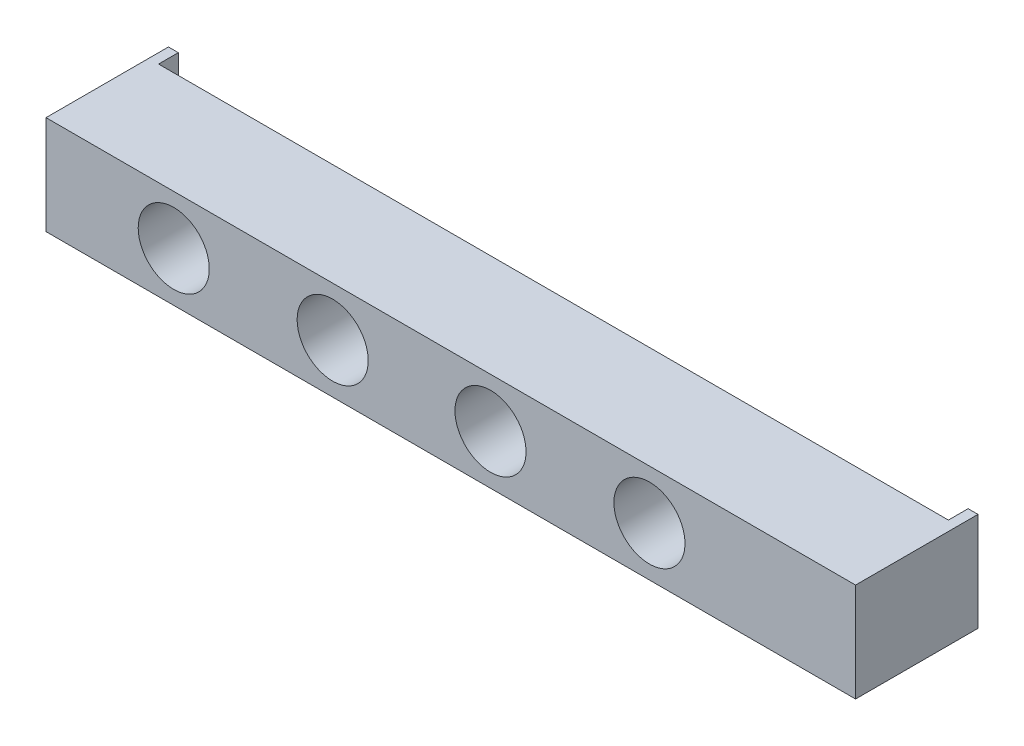
ISO-10303-21;
HEADER;
FILE_DESCRIPTION(('STEP AP214'),'2;1');
FILE_NAME('part.step','',(''),(''),'','','');
FILE_SCHEMA(('AUTOMOTIVE_DESIGN { 1 0 10303 214 1 1 1 1 }'));
ENDSEC;
DATA;
#1=APPLICATION_CONTEXT('core data for automotive mechanical design processes');
#2=APPLICATION_PROTOCOL_DEFINITION('international standard','automotive_design',2000,#1);
#3=PRODUCT_CONTEXT('',#1,'mechanical');
#4=PRODUCT('Part','Part','',(#3));
#5=PRODUCT_RELATED_PRODUCT_CATEGORY('part','',(#4));
#6=PRODUCT_DEFINITION_FORMATION('','',#4);
#7=PRODUCT_DEFINITION_CONTEXT('part definition',#1,'design');
#8=PRODUCT_DEFINITION('design','',#6,#7);
#9=PRODUCT_DEFINITION_SHAPE('','',#8);
#10=(LENGTH_UNIT() NAMED_UNIT(*) SI_UNIT(.MILLI.,.METRE.));
#11=(NAMED_UNIT(*) PLANE_ANGLE_UNIT() SI_UNIT($,.RADIAN.));
#12=(NAMED_UNIT(*) SI_UNIT($,.STERADIAN.) SOLID_ANGLE_UNIT());
#13=UNCERTAINTY_MEASURE_WITH_UNIT(LENGTH_MEASURE(1.E-05),#10,'distance_accuracy_value','');
#14=(GEOMETRIC_REPRESENTATION_CONTEXT(3) GLOBAL_UNCERTAINTY_ASSIGNED_CONTEXT((#13)) GLOBAL_UNIT_ASSIGNED_CONTEXT((#10,
#11,#12)) REPRESENTATION_CONTEXT('',''));
#15=CARTESIAN_POINT('',(0.,0.,0.));
#16=DIRECTION('',(0.,0.,1.));
#17=DIRECTION('',(1.,0.,0.));
#18=AXIS2_PLACEMENT_3D('',#15,#16,#17);
#19=CARTESIAN_POINT('',(0.,0.,0.));
#20=DIRECTION('',(0.,0.,-1.));
#21=DIRECTION('',(-1.,0.,0.));
#22=AXIS2_PLACEMENT_3D('',#19,#20,#21);
#23=PLANE('',#22);
#24=CARTESIAN_POINT('',(32.3443244123659,12.5,0.));
#25=DIRECTION('',(0.,0.,-1.));
#26=DIRECTION('',(-1.,0.,0.));
#27=AXIS2_PLACEMENT_3D('',#24,#25,#26);
#28=CIRCLE('',#27,8.99999999999999);
#29=CARTESIAN_POINT('',(23.3443244123659,12.5,0.));
#30=VERTEX_POINT('',#29);
#31=EDGE_CURVE('E330',#30,#30,#28,.T.);
#32=ORIENTED_EDGE('',*,*,#31,.F.);
#33=EDGE_LOOP('',(#32));
#34=FACE_BOUND('',#33,.T.);
#35=CARTESIAN_POINT('',(72.5886654471327,12.5,0.));
#36=DIRECTION('',(0.,0.,-1.));
#37=DIRECTION('',(-1.,0.,0.));
#38=AXIS2_PLACEMENT_3D('',#35,#36,#37);
#39=CIRCLE('',#38,8.99999999999999);
#40=CARTESIAN_POINT('',(63.5886654471327,12.5,0.));
#41=VERTEX_POINT('',#40);
#42=EDGE_CURVE('E332',#41,#41,#39,.T.);
#43=ORIENTED_EDGE('',*,*,#42,.F.);
#44=EDGE_LOOP('',(#43));
#45=FACE_BOUND('',#44,.T.);
#46=CARTESIAN_POINT('',(112.561085258692,12.5,0.));
#47=DIRECTION('',(0.,0.,-1.));
#48=DIRECTION('',(-1.,0.,0.));
#49=AXIS2_PLACEMENT_3D('',#46,#47,#48);
#50=CIRCLE('',#49,8.99999999999999);
#51=CARTESIAN_POINT('',(103.561085258692,12.5,0.));
#52=VERTEX_POINT('',#51);
#53=EDGE_CURVE('E340',#52,#52,#50,.T.);
#54=ORIENTED_EDGE('',*,*,#53,.F.);
#55=EDGE_LOOP('',(#54));
#56=FACE_BOUND('',#55,.T.);
#57=CARTESIAN_POINT('',(152.805426293458,12.5,0.));
#58=DIRECTION('',(0.,0.,-1.));
#59=DIRECTION('',(-1.,0.,0.));
#60=AXIS2_PLACEMENT_3D('',#57,#58,#59);
#61=CIRCLE('',#60,8.99999999999998);
#62=CARTESIAN_POINT('',(143.805426293458,12.5,0.));
#63=VERTEX_POINT('',#62);
#64=EDGE_CURVE('E345',#63,#63,#61,.T.);
#65=ORIENTED_EDGE('',*,*,#64,.F.);
#66=EDGE_LOOP('',(#65));
#67=FACE_BOUND('',#66,.T.);
#68=DIRECTION('',(-1.,0.,0.));
#69=VECTOR('',#68,1.);
#70=CARTESIAN_POINT('',(0.,25.,0.));
#71=LINE('',#70,#69);
#72=CARTESIAN_POINT('',(202.5,25.,0.));
#73=VERTEX_POINT('',#72);
#74=CARTESIAN_POINT('',(2.5,25.,0.));
#75=VERTEX_POINT('',#74);
#76=EDGE_CURVE('E55',#73,#75,#71,.T.);
#77=ORIENTED_EDGE('',*,*,#76,.F.);
#78=DIRECTION('',(0.,1.,0.));
#79=VECTOR('',#78,1.);
#80=CARTESIAN_POINT('',(202.5,25.,0.));
#81=LINE('',#80,#79);
#82=CARTESIAN_POINT('',(202.5,0.,0.));
#83=VERTEX_POINT('',#82);
#84=EDGE_CURVE('E121',#83,#73,#81,.T.);
#85=ORIENTED_EDGE('',*,*,#84,.F.);
#86=DIRECTION('',(1.,0.,0.));
#87=VECTOR('',#86,1.);
#88=CARTESIAN_POINT('',(0.,0.,0.));
#89=LINE('',#88,#87);
#90=CARTESIAN_POINT('',(2.5,0.,0.));
#91=VERTEX_POINT('',#90);
#92=EDGE_CURVE('E151',#91,#83,#89,.T.);
#93=ORIENTED_EDGE('',*,*,#92,.F.);
#94=DIRECTION('',(0.,-1.,0.));
#95=VECTOR('',#94,1.);
#96=CARTESIAN_POINT('',(2.5,25.,0.));
#97=LINE('',#96,#95);
#98=EDGE_CURVE('E132',#75,#91,#97,.T.);
#99=ORIENTED_EDGE('',*,*,#98,.F.);
#100=EDGE_LOOP('',(#77,#85,#93,#99));
#101=FACE_BOUND('',#100,.T.);
#102=ADVANCED_FACE('F35',(#34,#45,#56,#67,#101),#23,.T.);
#103=CARTESIAN_POINT('',(0.,0.,26.));
#104=DIRECTION('',(1.,0.,0.));
#105=DIRECTION('',(0.,0.,-1.));
#106=AXIS2_PLACEMENT_3D('',#103,#104,#105);
#107=PLANE('',#106);
#108=DIRECTION('',(0.,0.,-1.));
#109=VECTOR('',#108,1.);
#110=CARTESIAN_POINT('',(0.,25.,26.));
#111=LINE('',#110,#109);
#112=CARTESIAN_POINT('',(0.,25.,26.));
#113=VERTEX_POINT('',#112);
#114=CARTESIAN_POINT('',(0.,25.,-5.));
#115=VERTEX_POINT('',#114);
#116=EDGE_CURVE('E160',#113,#115,#111,.T.);
#117=ORIENTED_EDGE('',*,*,#116,.T.);
#118=DIRECTION('',(0.,1.,0.));
#119=VECTOR('',#118,1.);
#120=CARTESIAN_POINT('',(0.,25.,-5.));
#121=LINE('',#120,#119);
#122=CARTESIAN_POINT('',(0.,0.,-5.));
#123=VERTEX_POINT('',#122);
#124=EDGE_CURVE('E133',#123,#115,#121,.T.);
#125=ORIENTED_EDGE('',*,*,#124,.F.);
#126=DIRECTION('',(0.,0.,-1.));
#127=VECTOR('',#126,1.);
#128=CARTESIAN_POINT('',(0.,0.,26.));
#129=LINE('',#128,#127);
#130=CARTESIAN_POINT('',(0.,0.,26.));
#131=VERTEX_POINT('',#130);
#132=EDGE_CURVE('E11',#131,#123,#129,.T.);
#133=ORIENTED_EDGE('',*,*,#132,.F.);
#134=DIRECTION('',(0.,-1.,0.));
#135=VECTOR('',#134,1.);
#136=CARTESIAN_POINT('',(0.,0.,26.));
#137=LINE('',#136,#135);
#138=EDGE_CURVE('E152',#113,#131,#137,.T.);
#139=ORIENTED_EDGE('',*,*,#138,.F.);
#140=EDGE_LOOP('',(#117,#125,#133,#139));
#141=FACE_BOUND('',#140,.T.);
#142=ADVANCED_FACE('F37',(#141),#107,.F.);
#143=CARTESIAN_POINT('',(0.,0.,26.));
#144=DIRECTION('',(0.,1.,0.));
#145=DIRECTION('',(0.,0.,1.));
#146=AXIS2_PLACEMENT_3D('',#143,#144,#145);
#147=PLANE('',#146);
#148=ORIENTED_EDGE('',*,*,#132,.T.);
#149=DIRECTION('',(-1.,0.,0.));
#150=VECTOR('',#149,1.);
#151=CARTESIAN_POINT('',(0.,0.,-5.));
#152=LINE('',#151,#150);
#153=CARTESIAN_POINT('',(2.5,0.,-5.));
#154=VERTEX_POINT('',#153);
#155=EDGE_CURVE('E140',#154,#123,#152,.T.);
#156=ORIENTED_EDGE('',*,*,#155,.F.);
#157=DIRECTION('',(0.,0.,1.));
#158=VECTOR('',#157,1.);
#159=CARTESIAN_POINT('',(2.5,0.,-5.));
#160=LINE('',#159,#158);
#161=EDGE_CURVE('E143',#154,#91,#160,.T.);
#162=ORIENTED_EDGE('',*,*,#161,.T.);
#163=ORIENTED_EDGE('',*,*,#92,.T.);
#164=DIRECTION('',(0.,0.,1.));
#165=VECTOR('',#164,1.);
#166=CARTESIAN_POINT('',(202.5,0.,-5.));
#167=LINE('',#166,#165);
#168=CARTESIAN_POINT('',(202.5,0.,-5.));
#169=VERTEX_POINT('',#168);
#170=EDGE_CURVE('E113',#169,#83,#167,.T.);
#171=ORIENTED_EDGE('',*,*,#170,.F.);
#172=DIRECTION('',(-1.,0.,0.));
#173=VECTOR('',#172,1.);
#174=CARTESIAN_POINT('',(205.,0.,-5.));
#175=LINE('',#174,#173);
#176=CARTESIAN_POINT('',(205.,0.,-5.));
#177=VERTEX_POINT('',#176);
#178=EDGE_CURVE('E110',#177,#169,#175,.T.);
#179=ORIENTED_EDGE('',*,*,#178,.F.);
#180=DIRECTION('',(0.,0.,-1.));
#181=VECTOR('',#180,1.);
#182=CARTESIAN_POINT('',(205.,0.,26.));
#183=LINE('',#182,#181);
#184=CARTESIAN_POINT('',(205.,0.,26.));
#185=VERTEX_POINT('',#184);
#186=EDGE_CURVE('E43',#185,#177,#183,.T.);
#187=ORIENTED_EDGE('',*,*,#186,.F.);
#188=DIRECTION('',(1.,0.,0.));
#189=VECTOR('',#188,1.);
#190=CARTESIAN_POINT('',(0.,0.,26.));
#191=LINE('',#190,#189);
#192=EDGE_CURVE('E155',#131,#185,#191,.T.);
#193=ORIENTED_EDGE('',*,*,#192,.F.);
#194=EDGE_LOOP('',(#148,#156,#162,#163,#171,#179,#187,#193));
#195=FACE_BOUND('',#194,.T.);
#196=ADVANCED_FACE('F111',(#195),#147,.F.);
#197=CARTESIAN_POINT('',(205.,0.,26.));
#198=DIRECTION('',(-1.,0.,0.));
#199=DIRECTION('',(0.,0.,1.));
#200=AXIS2_PLACEMENT_3D('',#197,#198,#199);
#201=PLANE('',#200);
#202=ORIENTED_EDGE('',*,*,#186,.T.);
#203=DIRECTION('',(0.,-1.,0.));
#204=VECTOR('',#203,1.);
#205=CARTESIAN_POINT('',(205.,25.,-5.));
#206=LINE('',#205,#204);
#207=CARTESIAN_POINT('',(205.,25.,-5.));
#208=VERTEX_POINT('',#207);
#209=EDGE_CURVE('E105',#208,#177,#206,.T.);
#210=ORIENTED_EDGE('',*,*,#209,.F.);
#211=DIRECTION('',(0.,0.,-1.));
#212=VECTOR('',#211,1.);
#213=CARTESIAN_POINT('',(205.,25.,26.));
#214=LINE('',#213,#212);
#215=CARTESIAN_POINT('',(205.,25.,26.));
#216=VERTEX_POINT('',#215);
#217=EDGE_CURVE('E108',#216,#208,#214,.T.);
#218=ORIENTED_EDGE('',*,*,#217,.F.);
#219=DIRECTION('',(0.,1.,0.));
#220=VECTOR('',#219,1.);
#221=CARTESIAN_POINT('',(205.,0.,26.));
#222=LINE('',#221,#220);
#223=EDGE_CURVE('E106',#185,#216,#222,.T.);
#224=ORIENTED_EDGE('',*,*,#223,.F.);
#225=EDGE_LOOP('',(#202,#210,#218,#224));
#226=FACE_BOUND('',#225,.T.);
#227=ADVANCED_FACE('F102',(#226),#201,.F.);
#228=CARTESIAN_POINT('',(0.,25.,26.));
#229=DIRECTION('',(0.,-1.,0.));
#230=DIRECTION('',(0.,0.,-1.));
#231=AXIS2_PLACEMENT_3D('',#228,#229,#230);
#232=PLANE('',#231);
#233=ORIENTED_EDGE('',*,*,#217,.T.);
#234=DIRECTION('',(1.,0.,0.));
#235=VECTOR('',#234,1.);
#236=CARTESIAN_POINT('',(205.,25.,-5.));
#237=LINE('',#236,#235);
#238=CARTESIAN_POINT('',(202.5,25.,-5.));
#239=VERTEX_POINT('',#238);
#240=EDGE_CURVE('E120',#239,#208,#237,.T.);
#241=ORIENTED_EDGE('',*,*,#240,.F.);
#242=DIRECTION('',(0.,0.,1.));
#243=VECTOR('',#242,1.);
#244=CARTESIAN_POINT('',(202.5,25.,-5.));
#245=LINE('',#244,#243);
#246=EDGE_CURVE('E50',#239,#73,#245,.T.);
#247=ORIENTED_EDGE('',*,*,#246,.T.);
#248=ORIENTED_EDGE('',*,*,#76,.T.);
#249=DIRECTION('',(0.,0.,1.));
#250=VECTOR('',#249,1.);
#251=CARTESIAN_POINT('',(2.5,25.,-5.));
#252=LINE('',#251,#250);
#253=CARTESIAN_POINT('',(2.5,25.,-5.));
#254=VERTEX_POINT('',#253);
#255=EDGE_CURVE('E148',#254,#75,#252,.T.);
#256=ORIENTED_EDGE('',*,*,#255,.F.);
#257=DIRECTION('',(1.,0.,0.));
#258=VECTOR('',#257,1.);
#259=CARTESIAN_POINT('',(0.,25.,-5.));
#260=LINE('',#259,#258);
#261=EDGE_CURVE('E136',#115,#254,#260,.T.);
#262=ORIENTED_EDGE('',*,*,#261,.F.);
#263=ORIENTED_EDGE('',*,*,#116,.F.);
#264=DIRECTION('',(-1.,0.,0.));
#265=VECTOR('',#264,1.);
#266=CARTESIAN_POINT('',(0.,25.,26.));
#267=LINE('',#266,#265);
#268=EDGE_CURVE('E158',#216,#113,#267,.T.);
#269=ORIENTED_EDGE('',*,*,#268,.F.);
#270=EDGE_LOOP('',(#233,#241,#247,#248,#256,#262,#263,#269));
#271=FACE_BOUND('',#270,.T.);
#272=ADVANCED_FACE('F165',(#271),#232,.F.);
#273=CARTESIAN_POINT('',(0.,0.,26.));
#274=DIRECTION('',(0.,0.,-1.));
#275=DIRECTION('',(-1.,0.,0.));
#276=AXIS2_PLACEMENT_3D('',#273,#274,#275);
#277=PLANE('',#276);
#278=CARTESIAN_POINT('',(32.3443244123659,12.5,26.));
#279=DIRECTION('',(0.,0.,-1.));
#280=DIRECTION('',(-1.,0.,0.));
#281=AXIS2_PLACEMENT_3D('',#278,#279,#280);
#282=CIRCLE('',#281,8.99999999999999);
#283=CARTESIAN_POINT('',(23.3443244123659,12.5,26.));
#284=VERTEX_POINT('',#283);
#285=EDGE_CURVE('E328',#284,#284,#282,.T.);
#286=ORIENTED_EDGE('',*,*,#285,.T.);
#287=EDGE_LOOP('',(#286));
#288=FACE_BOUND('',#287,.T.);
#289=CARTESIAN_POINT('',(72.5886654471327,12.5,26.));
#290=DIRECTION('',(0.,0.,-1.));
#291=DIRECTION('',(-1.,0.,0.));
#292=AXIS2_PLACEMENT_3D('',#289,#290,#291);
#293=CIRCLE('',#292,8.99999999999998);
#294=CARTESIAN_POINT('',(63.5886654471327,12.5,26.));
#295=VERTEX_POINT('',#294);
#296=EDGE_CURVE('E337',#295,#295,#293,.T.);
#297=ORIENTED_EDGE('',*,*,#296,.T.);
#298=EDGE_LOOP('',(#297));
#299=FACE_BOUND('',#298,.T.);
#300=CARTESIAN_POINT('',(112.561085258692,12.5,26.));
#301=DIRECTION('',(0.,0.,-1.));
#302=DIRECTION('',(-1.,0.,0.));
#303=AXIS2_PLACEMENT_3D('',#300,#301,#302);
#304=CIRCLE('',#303,8.99999999999998);
#305=CARTESIAN_POINT('',(103.561085258692,12.5,26.));
#306=VERTEX_POINT('',#305);
#307=EDGE_CURVE('E343',#306,#306,#304,.T.);
#308=ORIENTED_EDGE('',*,*,#307,.T.);
#309=EDGE_LOOP('',(#308));
#310=FACE_BOUND('',#309,.T.);
#311=CARTESIAN_POINT('',(152.805426293458,12.5,26.));
#312=DIRECTION('',(0.,0.,-1.));
#313=DIRECTION('',(-1.,0.,0.));
#314=AXIS2_PLACEMENT_3D('',#311,#312,#313);
#315=CIRCLE('',#314,8.99999999999998);
#316=CARTESIAN_POINT('',(143.805426293458,12.5,26.));
#317=VERTEX_POINT('',#316);
#318=EDGE_CURVE('E123',#317,#317,#315,.T.);
#319=ORIENTED_EDGE('',*,*,#318,.T.);
#320=EDGE_LOOP('',(#319));
#321=FACE_BOUND('',#320,.T.);
#322=ORIENTED_EDGE('',*,*,#138,.T.);
#323=ORIENTED_EDGE('',*,*,#192,.T.);
#324=ORIENTED_EDGE('',*,*,#223,.T.);
#325=ORIENTED_EDGE('',*,*,#268,.T.);
#326=EDGE_LOOP('',(#322,#323,#324,#325));
#327=FACE_BOUND('',#326,.T.);
#328=ADVANCED_FACE('F170',(#288,#299,#310,#321,#327),#277,.F.);
#329=CARTESIAN_POINT('',(2.5,25.,-5.));
#330=DIRECTION('',(-1.,0.,0.));
#331=DIRECTION('',(0.,-1.,0.));
#332=AXIS2_PLACEMENT_3D('',#329,#330,#331);
#333=PLANE('',#332);
#334=ORIENTED_EDGE('',*,*,#98,.T.);
#335=ORIENTED_EDGE('',*,*,#161,.F.);
#336=DIRECTION('',(0.,-1.,0.));
#337=VECTOR('',#336,1.);
#338=CARTESIAN_POINT('',(2.5,25.,-5.));
#339=LINE('',#338,#337);
#340=EDGE_CURVE('E138',#254,#154,#339,.T.);
#341=ORIENTED_EDGE('',*,*,#340,.F.);
#342=ORIENTED_EDGE('',*,*,#255,.T.);
#343=EDGE_LOOP('',(#334,#335,#341,#342));
#344=FACE_BOUND('',#343,.T.);
#345=ADVANCED_FACE('F180',(#344),#333,.F.);
#346=CARTESIAN_POINT('',(0.,0.,-5.));
#347=DIRECTION('',(0.,0.,1.));
#348=DIRECTION('',(1.,0.,0.));
#349=AXIS2_PLACEMENT_3D('',#346,#347,#348);
#350=PLANE('',#349);
#351=ORIENTED_EDGE('',*,*,#124,.T.);
#352=ORIENTED_EDGE('',*,*,#261,.T.);
#353=ORIENTED_EDGE('',*,*,#340,.T.);
#354=ORIENTED_EDGE('',*,*,#155,.T.);
#355=EDGE_LOOP('',(#351,#352,#353,#354));
#356=FACE_BOUND('',#355,.T.);
#357=ADVANCED_FACE('F176',(#356),#350,.F.);
#358=CARTESIAN_POINT('',(202.5,25.,-5.));
#359=DIRECTION('',(1.,0.,0.));
#360=DIRECTION('',(0.,0.,-1.));
#361=AXIS2_PLACEMENT_3D('',#358,#359,#360);
#362=PLANE('',#361);
#363=ORIENTED_EDGE('',*,*,#84,.T.);
#364=ORIENTED_EDGE('',*,*,#246,.F.);
#365=DIRECTION('',(0.,1.,0.));
#366=VECTOR('',#365,1.);
#367=CARTESIAN_POINT('',(202.5,25.,-5.));
#368=LINE('',#367,#366);
#369=EDGE_CURVE('E116',#169,#239,#368,.T.);
#370=ORIENTED_EDGE('',*,*,#369,.F.);
#371=ORIENTED_EDGE('',*,*,#170,.T.);
#372=EDGE_LOOP('',(#363,#364,#370,#371));
#373=FACE_BOUND('',#372,.T.);
#374=ADVANCED_FACE('F184',(#373),#362,.F.);
#375=CARTESIAN_POINT('',(0.,0.,-5.));
#376=DIRECTION('',(0.,0.,-1.));
#377=DIRECTION('',(-1.,0.,0.));
#378=AXIS2_PLACEMENT_3D('',#375,#376,#377);
#379=PLANE('',#378);
#380=ORIENTED_EDGE('',*,*,#209,.T.);
#381=ORIENTED_EDGE('',*,*,#178,.T.);
#382=ORIENTED_EDGE('',*,*,#369,.T.);
#383=ORIENTED_EDGE('',*,*,#240,.T.);
#384=EDGE_LOOP('',(#380,#381,#382,#383));
#385=FACE_BOUND('',#384,.T.);
#386=ADVANCED_FACE('F119',(#385),#379,.T.);
#387=CARTESIAN_POINT('',(152.805426293458,12.5,0.));
#388=DIRECTION('',(0.,0.,-1.));
#389=DIRECTION('',(-1.,0.,0.));
#390=AXIS2_PLACEMENT_3D('',#387,#388,#389);
#391=CYLINDRICAL_SURFACE('',#390,8.99999999999998);
#392=ORIENTED_EDGE('',*,*,#318,.F.);
#393=EDGE_LOOP('',(#392));
#394=FACE_BOUND('',#393,.T.);
#395=ORIENTED_EDGE('',*,*,#64,.T.);
#396=EDGE_LOOP('',(#395));
#397=FACE_BOUND('',#396,.T.);
#398=ADVANCED_FACE('F191',(#394,#397),#391,.F.);
#399=CARTESIAN_POINT('',(112.561085258692,12.5,0.));
#400=DIRECTION('',(0.,0.,-1.));
#401=DIRECTION('',(-1.,0.,0.));
#402=AXIS2_PLACEMENT_3D('',#399,#400,#401);
#403=CYLINDRICAL_SURFACE('',#402,8.99999999999999);
#404=ORIENTED_EDGE('',*,*,#307,.F.);
#405=EDGE_LOOP('',(#404));
#406=FACE_BOUND('',#405,.T.);
#407=ORIENTED_EDGE('',*,*,#53,.T.);
#408=EDGE_LOOP('',(#407));
#409=FACE_BOUND('',#408,.T.);
#410=ADVANCED_FACE('F291',(#406,#409),#403,.F.);
#411=CARTESIAN_POINT('',(72.5886654471327,12.5,0.));
#412=DIRECTION('',(0.,0.,-1.));
#413=DIRECTION('',(-1.,0.,0.));
#414=AXIS2_PLACEMENT_3D('',#411,#412,#413);
#415=CYLINDRICAL_SURFACE('',#414,8.99999999999999);
#416=ORIENTED_EDGE('',*,*,#296,.F.);
#417=EDGE_LOOP('',(#416));
#418=FACE_BOUND('',#417,.T.);
#419=ORIENTED_EDGE('',*,*,#42,.T.);
#420=EDGE_LOOP('',(#419));
#421=FACE_BOUND('',#420,.T.);
#422=ADVANCED_FACE('F298',(#418,#421),#415,.F.);
#423=CARTESIAN_POINT('',(32.3443244123659,12.5,0.));
#424=DIRECTION('',(0.,0.,-1.));
#425=DIRECTION('',(-1.,0.,0.));
#426=AXIS2_PLACEMENT_3D('',#423,#424,#425);
#427=CYLINDRICAL_SURFACE('',#426,8.99999999999999);
#428=ORIENTED_EDGE('',*,*,#285,.F.);
#429=EDGE_LOOP('',(#428));
#430=FACE_BOUND('',#429,.T.);
#431=ORIENTED_EDGE('',*,*,#31,.T.);
#432=EDGE_LOOP('',(#431));
#433=FACE_BOUND('',#432,.T.);
#434=ADVANCED_FACE('F306',(#430,#433),#427,.F.);
#435=CLOSED_SHELL('',(#102,#142,#196,#227,#272,#328,#345,#357,#374,#386,#398,#410,#422,#434));
#436=MANIFOLD_SOLID_BREP('B2',#435);
#437=ADVANCED_BREP_SHAPE_REPRESENTATION('',(#18,#436),#14);
#438=SHAPE_DEFINITION_REPRESENTATION(#9,#437);
ENDSEC;
END-ISO-10303-21;
